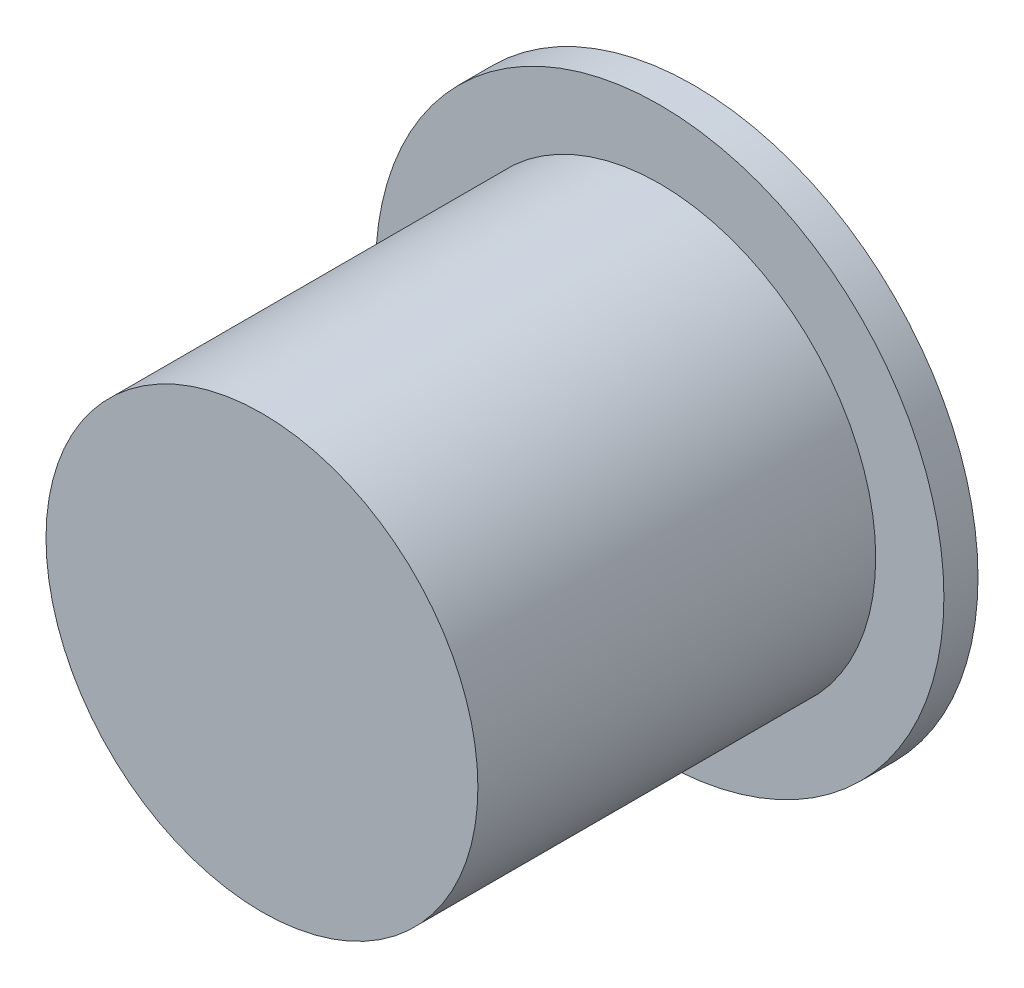
ISO-10303-21;
HEADER;
FILE_DESCRIPTION(('STEP AP214'),'2;1');
FILE_NAME('part.step','',(''),(''),'','','');
FILE_SCHEMA(('AUTOMOTIVE_DESIGN { 1 0 10303 214 1 1 1 1 }'));
ENDSEC;
DATA;
#1=APPLICATION_CONTEXT('core data for automotive mechanical design processes');
#2=APPLICATION_PROTOCOL_DEFINITION('international standard','automotive_design',2000,#1);
#3=PRODUCT_CONTEXT('',#1,'mechanical');
#4=PRODUCT('Part','Part','',(#3));
#5=PRODUCT_RELATED_PRODUCT_CATEGORY('part','',(#4));
#6=PRODUCT_DEFINITION_FORMATION('','',#4);
#7=PRODUCT_DEFINITION_CONTEXT('part definition',#1,'design');
#8=PRODUCT_DEFINITION('design','',#6,#7);
#9=PRODUCT_DEFINITION_SHAPE('','',#8);
#10=(LENGTH_UNIT() NAMED_UNIT(*) SI_UNIT(.MILLI.,.METRE.));
#11=(NAMED_UNIT(*) PLANE_ANGLE_UNIT() SI_UNIT($,.RADIAN.));
#12=(NAMED_UNIT(*) SI_UNIT($,.STERADIAN.) SOLID_ANGLE_UNIT());
#13=UNCERTAINTY_MEASURE_WITH_UNIT(LENGTH_MEASURE(1.E-05),#10,'distance_accuracy_value','');
#14=(GEOMETRIC_REPRESENTATION_CONTEXT(3) GLOBAL_UNCERTAINTY_ASSIGNED_CONTEXT((#13)) GLOBAL_UNIT_ASSIGNED_CONTEXT((#10,
#11,#12)) REPRESENTATION_CONTEXT('',''));
#15=CARTESIAN_POINT('',(0.,0.,0.));
#16=DIRECTION('',(0.,0.,1.));
#17=DIRECTION('',(1.,0.,0.));
#18=AXIS2_PLACEMENT_3D('',#15,#16,#17);
#19=CARTESIAN_POINT('',(0.,0.,35.));
#20=DIRECTION('',(0.,0.,-1.));
#21=DIRECTION('',(-1.,0.,0.));
#22=AXIS2_PLACEMENT_3D('',#19,#20,#21);
#23=CYLINDRICAL_SURFACE('',#22,19.);
#24=CARTESIAN_POINT('',(0.,0.,35.));
#25=DIRECTION('',(0.,0.,1.));
#26=DIRECTION('',(1.,0.,0.));
#27=AXIS2_PLACEMENT_3D('',#24,#25,#26);
#28=CIRCLE('',#27,19.);
#29=CARTESIAN_POINT('',(19.,0.,35.));
#30=VERTEX_POINT('',#29);
#31=EDGE_CURVE('E36',#30,#30,#28,.T.);
#32=ORIENTED_EDGE('',*,*,#31,.F.);
#33=EDGE_LOOP('',(#32));
#34=FACE_BOUND('',#33,.T.);
#35=CARTESIAN_POINT('',(0.,0.,0.));
#36=DIRECTION('',(0.,0.,1.));
#37=DIRECTION('',(1.,0.,0.));
#38=AXIS2_PLACEMENT_3D('',#35,#36,#37);
#39=CIRCLE('',#38,19.);
#40=CARTESIAN_POINT('',(19.,0.,0.));
#41=VERTEX_POINT('',#40);
#42=EDGE_CURVE('E44',#41,#41,#39,.T.);
#43=ORIENTED_EDGE('',*,*,#42,.T.);
#44=EDGE_LOOP('',(#43));
#45=FACE_BOUND('',#44,.T.);
#46=ADVANCED_FACE('F33',(#34,#45),#23,.T.);
#47=CARTESIAN_POINT('',(0.,0.,35.));
#48=DIRECTION('',(0.,0.,1.));
#49=DIRECTION('',(1.,0.,0.));
#50=AXIS2_PLACEMENT_3D('',#47,#48,#49);
#51=PLANE('',#50);
#52=ORIENTED_EDGE('',*,*,#31,.T.);
#53=EDGE_LOOP('',(#52));
#54=FACE_BOUND('',#53,.T.);
#55=ADVANCED_FACE('F71',(#54),#51,.T.);
#56=CARTESIAN_POINT('',(0.,0.,-3.));
#57=DIRECTION('',(0.,0.,1.));
#58=DIRECTION('',(1.,0.,0.));
#59=AXIS2_PLACEMENT_3D('',#56,#57,#58);
#60=CYLINDRICAL_SURFACE('',#59,25.);
#61=CARTESIAN_POINT('',(0.,0.,-3.));
#62=DIRECTION('',(0.,0.,-1.));
#63=DIRECTION('',(-1.,0.,0.));
#64=AXIS2_PLACEMENT_3D('',#61,#62,#63);
#65=CIRCLE('',#64,25.);
#66=CARTESIAN_POINT('',(-25.,0.,-3.));
#67=VERTEX_POINT('',#66);
#68=EDGE_CURVE('E55',#67,#67,#65,.T.);
#69=ORIENTED_EDGE('',*,*,#68,.F.);
#70=EDGE_LOOP('',(#69));
#71=FACE_BOUND('',#70,.T.);
#72=CARTESIAN_POINT('',(0.,0.,0.));
#73=DIRECTION('',(0.,0.,-1.));
#74=DIRECTION('',(-1.,0.,0.));
#75=AXIS2_PLACEMENT_3D('',#72,#73,#74);
#76=CIRCLE('',#75,25.);
#77=CARTESIAN_POINT('',(-25.,0.,0.));
#78=VERTEX_POINT('',#77);
#79=EDGE_CURVE('E52',#78,#78,#76,.T.);
#80=ORIENTED_EDGE('',*,*,#79,.T.);
#81=EDGE_LOOP('',(#80));
#82=FACE_BOUND('',#81,.T.);
#83=ADVANCED_FACE('F69',(#71,#82),#60,.T.);
#84=CARTESIAN_POINT('',(0.,0.,-3.));
#85=DIRECTION('',(0.,0.,-1.));
#86=DIRECTION('',(-1.,0.,0.));
#87=AXIS2_PLACEMENT_3D('',#84,#85,#86);
#88=PLANE('',#87);
#89=CARTESIAN_POINT('',(0.,0.,-3.));
#90=DIRECTION('',(0.,0.,-1.));
#91=DIRECTION('',(-1.,0.,0.));
#92=AXIS2_PLACEMENT_3D('',#89,#90,#91);
#93=CIRCLE('',#92,10.);
#94=CARTESIAN_POINT('',(-10.,0.,-3.));
#95=VERTEX_POINT('',#94);
#96=EDGE_CURVE('E10',#95,#95,#93,.T.);
#97=ORIENTED_EDGE('',*,*,#96,.F.);
#98=EDGE_LOOP('',(#97));
#99=FACE_BOUND('',#98,.T.);
#100=ORIENTED_EDGE('',*,*,#68,.T.);
#101=EDGE_LOOP('',(#100));
#102=FACE_BOUND('',#101,.T.);
#103=ADVANCED_FACE('F65',(#99,#102),#88,.T.);
#104=CARTESIAN_POINT('',(0.,0.,0.));
#105=DIRECTION('',(0.,0.,-1.));
#106=DIRECTION('',(-1.,0.,0.));
#107=AXIS2_PLACEMENT_3D('',#104,#105,#106);
#108=PLANE('',#107);
#109=ORIENTED_EDGE('',*,*,#42,.F.);
#110=EDGE_LOOP('',(#109));
#111=FACE_BOUND('',#110,.T.);
#112=ORIENTED_EDGE('',*,*,#79,.F.);
#113=EDGE_LOOP('',(#112));
#114=FACE_BOUND('',#113,.T.);
#115=ADVANCED_FACE('F61',(#111,#114),#108,.F.);
#116=CARTESIAN_POINT('',(0.,0.,-5.));
#117=DIRECTION('',(0.,0.,1.));
#118=DIRECTION('',(1.,0.,0.));
#119=AXIS2_PLACEMENT_3D('',#116,#117,#118);
#120=CYLINDRICAL_SURFACE('',#119,10.);
#121=CARTESIAN_POINT('',(0.,0.,-5.));
#122=DIRECTION('',(0.,0.,-1.));
#123=DIRECTION('',(-1.,0.,0.));
#124=AXIS2_PLACEMENT_3D('',#121,#122,#123);
#125=CIRCLE('',#124,10.);
#126=CARTESIAN_POINT('',(-10.,0.,-5.));
#127=VERTEX_POINT('',#126);
#128=EDGE_CURVE('E49',#127,#127,#125,.T.);
#129=ORIENTED_EDGE('',*,*,#128,.F.);
#130=EDGE_LOOP('',(#129));
#131=FACE_BOUND('',#130,.T.);
#132=ORIENTED_EDGE('',*,*,#96,.T.);
#133=EDGE_LOOP('',(#132));
#134=FACE_BOUND('',#133,.T.);
#135=ADVANCED_FACE('F64',(#131,#134),#120,.T.);
#136=CARTESIAN_POINT('',(0.,0.,-5.));
#137=DIRECTION('',(0.,0.,-1.));
#138=DIRECTION('',(-1.,0.,0.));
#139=AXIS2_PLACEMENT_3D('',#136,#137,#138);
#140=PLANE('',#139);
#141=CARTESIAN_POINT('',(0.,0.,-5.));
#142=DIRECTION('',(0.,0.,-1.));
#143=DIRECTION('',(-1.,0.,0.));
#144=AXIS2_PLACEMENT_3D('',#141,#142,#143);
#145=CIRCLE('',#144,2.5);
#146=CARTESIAN_POINT('',(-2.5,0.,-5.));
#147=VERTEX_POINT('',#146);
#148=EDGE_CURVE('E136',#147,#147,#145,.T.);
#149=ORIENTED_EDGE('',*,*,#148,.F.);
#150=EDGE_LOOP('',(#149));
#151=FACE_BOUND('',#150,.T.);
#152=ORIENTED_EDGE('',*,*,#128,.T.);
#153=EDGE_LOOP('',(#152));
#154=FACE_BOUND('',#153,.T.);
#155=ADVANCED_FACE('F108',(#151,#154),#140,.T.);
#156=CARTESIAN_POINT('',(0.,0.,5.));
#157=DIRECTION('',(0.,0.,-1.));
#158=DIRECTION('',(-1.,0.,0.));
#159=AXIS2_PLACEMENT_3D('',#156,#157,#158);
#160=CYLINDRICAL_SURFACE('',#159,2.5);
#161=CARTESIAN_POINT('',(0.,0.,5.));
#162=DIRECTION('',(0.,0.,-1.));
#163=DIRECTION('',(-1.,0.,0.));
#164=AXIS2_PLACEMENT_3D('',#161,#162,#163);
#165=CIRCLE('',#164,2.5);
#166=CARTESIAN_POINT('',(-2.5,0.,5.));
#167=VERTEX_POINT('',#166);
#168=EDGE_CURVE('E47',#167,#167,#165,.T.);
#169=ORIENTED_EDGE('',*,*,#168,.F.);
#170=EDGE_LOOP('',(#169));
#171=FACE_BOUND('',#170,.T.);
#172=ORIENTED_EDGE('',*,*,#148,.T.);
#173=EDGE_LOOP('',(#172));
#174=FACE_BOUND('',#173,.T.);
#175=ADVANCED_FACE('F116',(#171,#174),#160,.F.);
#176=CARTESIAN_POINT('',(0.,0.,5.));
#177=DIRECTION('',(0.,0.,-1.));
#178=DIRECTION('',(-1.,0.,0.));
#179=AXIS2_PLACEMENT_3D('',#176,#177,#178);
#180=PLANE('',#179);
#181=ORIENTED_EDGE('',*,*,#168,.T.);
#182=EDGE_LOOP('',(#181));
#183=FACE_BOUND('',#182,.T.);
#184=ADVANCED_FACE('F124',(#183),#180,.T.);
#185=CLOSED_SHELL('',(#46,#55,#83,#103,#115,#135,#155,#175,#184));
#186=MANIFOLD_SOLID_BREP('B2',#185);
#187=ADVANCED_BREP_SHAPE_REPRESENTATION('',(#18,#186),#14);
#188=SHAPE_DEFINITION_REPRESENTATION(#9,#187);
ENDSEC;
END-ISO-10303-21;
